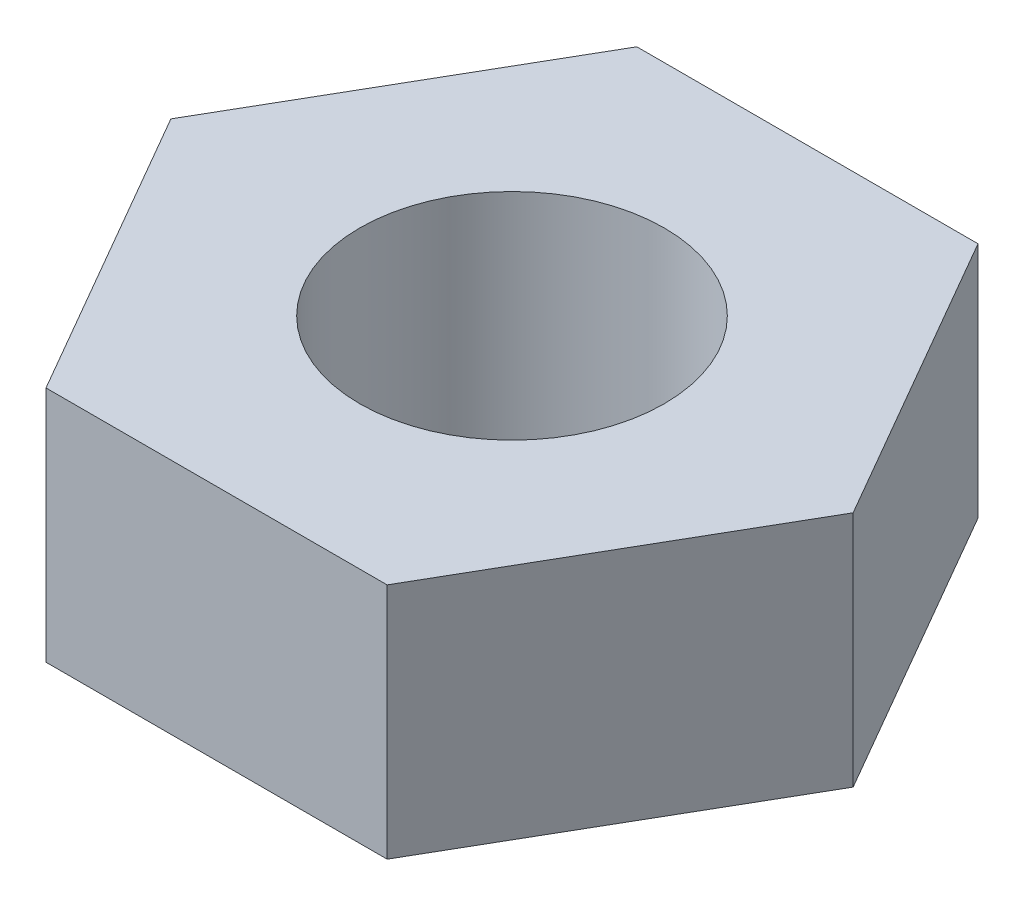
ISO-10303-21;
HEADER;
FILE_DESCRIPTION(('STEP AP214'),'2;1');
FILE_NAME('part.step','',(''),(''),'','','');
FILE_SCHEMA(('AUTOMOTIVE_DESIGN { 1 0 10303 214 1 1 1 1 }'));
ENDSEC;
DATA;
#1=APPLICATION_CONTEXT('core data for automotive mechanical design processes');
#2=APPLICATION_PROTOCOL_DEFINITION('international standard','automotive_design',2000,#1);
#3=PRODUCT_CONTEXT('',#1,'mechanical');
#4=PRODUCT('Part','Part','',(#3));
#5=PRODUCT_RELATED_PRODUCT_CATEGORY('part','',(#4));
#6=PRODUCT_DEFINITION_FORMATION('','',#4);
#7=PRODUCT_DEFINITION_CONTEXT('part definition',#1,'design');
#8=PRODUCT_DEFINITION('design','',#6,#7);
#9=PRODUCT_DEFINITION_SHAPE('','',#8);
#10=(LENGTH_UNIT() NAMED_UNIT(*) SI_UNIT(.MILLI.,.METRE.));
#11=(NAMED_UNIT(*) PLANE_ANGLE_UNIT() SI_UNIT($,.RADIAN.));
#12=(NAMED_UNIT(*) SI_UNIT($,.STERADIAN.) SOLID_ANGLE_UNIT());
#13=UNCERTAINTY_MEASURE_WITH_UNIT(LENGTH_MEASURE(1.E-05),#10,'distance_accuracy_value','');
#14=(GEOMETRIC_REPRESENTATION_CONTEXT(3) GLOBAL_UNCERTAINTY_ASSIGNED_CONTEXT((#13)) GLOBAL_UNIT_ASSIGNED_CONTEXT((#10,
#11,#12)) REPRESENTATION_CONTEXT('',''));
#15=CARTESIAN_POINT('',(0.,0.,0.));
#16=DIRECTION('',(0.,0.,1.));
#17=DIRECTION('',(1.,0.,0.));
#18=AXIS2_PLACEMENT_3D('',#15,#16,#17);
#19=CARTESIAN_POINT('',(0.,1.95,0.));
#20=DIRECTION('',(0.,1.,0.));
#21=DIRECTION('',(0.,0.,1.));
#22=AXIS2_PLACEMENT_3D('',#19,#20,#21);
#23=PLANE('',#22);
#24=DIRECTION('',(1.,0.,0.));
#25=VECTOR('',#24,1.);
#26=CARTESIAN_POINT('',(-1.40007440278484,1.95,2.425));
#27=LINE('',#26,#25);
#28=CARTESIAN_POINT('',(-1.40007440278484,1.95,2.425));
#29=VERTEX_POINT('',#28);
#30=CARTESIAN_POINT('',(1.40007440278484,1.95,2.425));
#31=VERTEX_POINT('',#30);
#32=EDGE_CURVE('E129',#29,#31,#27,.T.);
#33=ORIENTED_EDGE('',*,*,#32,.T.);
#34=DIRECTION('',(0.5,0.,-0.866025403784439));
#35=VECTOR('',#34,1.);
#36=CARTESIAN_POINT('',(1.40007440278484,1.95,2.425));
#37=LINE('',#36,#35);
#38=CARTESIAN_POINT('',(2.80014880556968,1.95,0.));
#39=VERTEX_POINT('',#38);
#40=EDGE_CURVE('E87',#31,#39,#37,.T.);
#41=ORIENTED_EDGE('',*,*,#40,.T.);
#42=DIRECTION('',(-0.5,0.,-0.866025403784438));
#43=VECTOR('',#42,1.);
#44=CARTESIAN_POINT('',(2.80014880556968,1.95,0.));
#45=LINE('',#44,#43);
#46=CARTESIAN_POINT('',(1.40007440278484,1.95,-2.425));
#47=VERTEX_POINT('',#46);
#48=EDGE_CURVE('E100',#39,#47,#45,.T.);
#49=ORIENTED_EDGE('',*,*,#48,.T.);
#50=DIRECTION('',(-1.,0.,0.));
#51=VECTOR('',#50,1.);
#52=CARTESIAN_POINT('',(1.40007440278484,1.95,-2.425));
#53=LINE('',#52,#51);
#54=CARTESIAN_POINT('',(-1.40007440278484,1.95,-2.425));
#55=VERTEX_POINT('',#54);
#56=EDGE_CURVE('E94',#47,#55,#53,.T.);
#57=ORIENTED_EDGE('',*,*,#56,.T.);
#58=DIRECTION('',(-0.5,0.,0.866025403784439));
#59=VECTOR('',#58,1.);
#60=CARTESIAN_POINT('',(-1.40007440278484,1.95,-2.425));
#61=LINE('',#60,#59);
#62=CARTESIAN_POINT('',(-2.80014880556968,1.95,0.));
#63=VERTEX_POINT('',#62);
#64=EDGE_CURVE('E98',#55,#63,#61,.T.);
#65=ORIENTED_EDGE('',*,*,#64,.T.);
#66=DIRECTION('',(0.5,0.,0.866025403784439));
#67=VECTOR('',#66,1.);
#68=CARTESIAN_POINT('',(-2.80014880556968,1.95,0.));
#69=LINE('',#68,#67);
#70=EDGE_CURVE('E50',#63,#29,#69,.T.);
#71=ORIENTED_EDGE('',*,*,#70,.T.);
#72=EDGE_LOOP('',(#33,#41,#49,#57,#65,#71));
#73=FACE_BOUND('',#72,.T.);
#74=CARTESIAN_POINT('',(0.,1.95,0.));
#75=DIRECTION('',(0.,1.,0.));
#76=DIRECTION('',(0.,0.,1.));
#77=AXIS2_PLACEMENT_3D('',#74,#75,#76);
#78=CIRCLE('',#77,1.25);
#79=CARTESIAN_POINT('',(0.,1.95,1.25));
#80=VERTEX_POINT('',#79);
#81=EDGE_CURVE('E122',#80,#80,#78,.T.);
#82=ORIENTED_EDGE('',*,*,#81,.F.);
#83=EDGE_LOOP('',(#82));
#84=FACE_BOUND('',#83,.T.);
#85=ADVANCED_FACE('F33',(#73,#84),#23,.T.);
#86=CARTESIAN_POINT('',(0.,0.,0.));
#87=DIRECTION('',(0.,1.,0.));
#88=DIRECTION('',(0.,0.,1.));
#89=AXIS2_PLACEMENT_3D('',#86,#87,#88);
#90=PLANE('',#89);
#91=DIRECTION('',(1.,0.,0.));
#92=VECTOR('',#91,1.);
#93=CARTESIAN_POINT('',(-1.40007440278484,0.,2.425));
#94=LINE('',#93,#92);
#95=CARTESIAN_POINT('',(-1.40007440278484,0.,2.425));
#96=VERTEX_POINT('',#95);
#97=CARTESIAN_POINT('',(1.40007440278484,0.,2.425));
#98=VERTEX_POINT('',#97);
#99=EDGE_CURVE('E118',#96,#98,#94,.T.);
#100=ORIENTED_EDGE('',*,*,#99,.F.);
#101=DIRECTION('',(0.5,0.,0.866025403784439));
#102=VECTOR('',#101,1.);
#103=CARTESIAN_POINT('',(-2.80014880556968,0.,0.));
#104=LINE('',#103,#102);
#105=CARTESIAN_POINT('',(-2.80014880556968,0.,0.));
#106=VERTEX_POINT('',#105);
#107=EDGE_CURVE('E79',#106,#96,#104,.T.);
#108=ORIENTED_EDGE('',*,*,#107,.F.);
#109=DIRECTION('',(-0.5,0.,0.866025403784439));
#110=VECTOR('',#109,1.);
#111=CARTESIAN_POINT('',(-1.40007440278484,0.,-2.425));
#112=LINE('',#111,#110);
#113=CARTESIAN_POINT('',(-1.40007440278484,0.,-2.425));
#114=VERTEX_POINT('',#113);
#115=EDGE_CURVE('E73',#114,#106,#112,.T.);
#116=ORIENTED_EDGE('',*,*,#115,.F.);
#117=DIRECTION('',(-1.,0.,0.));
#118=VECTOR('',#117,1.);
#119=CARTESIAN_POINT('',(1.40007440278484,0.,-2.425));
#120=LINE('',#119,#118);
#121=CARTESIAN_POINT('',(1.40007440278484,0.,-2.425));
#122=VERTEX_POINT('',#121);
#123=EDGE_CURVE('E108',#122,#114,#120,.T.);
#124=ORIENTED_EDGE('',*,*,#123,.F.);
#125=DIRECTION('',(-0.5,0.,-0.866025403784438));
#126=VECTOR('',#125,1.);
#127=CARTESIAN_POINT('',(2.80014880556968,0.,0.));
#128=LINE('',#127,#126);
#129=CARTESIAN_POINT('',(2.80014880556968,0.,0.));
#130=VERTEX_POINT('',#129);
#131=EDGE_CURVE('E124',#130,#122,#128,.T.);
#132=ORIENTED_EDGE('',*,*,#131,.F.);
#133=DIRECTION('',(0.5,0.,-0.866025403784439));
#134=VECTOR('',#133,1.);
#135=CARTESIAN_POINT('',(1.40007440278484,0.,2.425));
#136=LINE('',#135,#134);
#137=EDGE_CURVE('E121',#98,#130,#136,.T.);
#138=ORIENTED_EDGE('',*,*,#137,.F.);
#139=EDGE_LOOP('',(#100,#108,#116,#124,#132,#138));
#140=FACE_BOUND('',#139,.T.);
#141=CARTESIAN_POINT('',(0.,0.,0.));
#142=DIRECTION('',(0.,1.,0.));
#143=DIRECTION('',(0.,0.,1.));
#144=AXIS2_PLACEMENT_3D('',#141,#142,#143);
#145=CIRCLE('',#144,1.25);
#146=CARTESIAN_POINT('',(0.,0.,1.25));
#147=VERTEX_POINT('',#146);
#148=EDGE_CURVE('E222',#147,#147,#145,.T.);
#149=ORIENTED_EDGE('',*,*,#148,.T.);
#150=EDGE_LOOP('',(#149));
#151=FACE_BOUND('',#150,.T.);
#152=ADVANCED_FACE('F138',(#140,#151),#90,.F.);
#153=CARTESIAN_POINT('',(-1.40007440278484,1.95,2.425));
#154=DIRECTION('',(0.,0.,-1.));
#155=DIRECTION('',(-1.,0.,0.));
#156=AXIS2_PLACEMENT_3D('',#153,#154,#155);
#157=PLANE('',#156);
#158=ORIENTED_EDGE('',*,*,#99,.T.);
#159=DIRECTION('',(0.,-1.,0.));
#160=VECTOR('',#159,1.);
#161=CARTESIAN_POINT('',(1.40007440278484,1.95,2.425));
#162=LINE('',#161,#160);
#163=EDGE_CURVE('E11',#31,#98,#162,.T.);
#164=ORIENTED_EDGE('',*,*,#163,.F.);
#165=ORIENTED_EDGE('',*,*,#32,.F.);
#166=DIRECTION('',(0.,-1.,0.));
#167=VECTOR('',#166,1.);
#168=CARTESIAN_POINT('',(-1.40007440278484,1.95,2.425));
#169=LINE('',#168,#167);
#170=EDGE_CURVE('E114',#29,#96,#169,.T.);
#171=ORIENTED_EDGE('',*,*,#170,.T.);
#172=EDGE_LOOP('',(#158,#164,#165,#171));
#173=FACE_BOUND('',#172,.T.);
#174=ADVANCED_FACE('F35',(#173),#157,.F.);
#175=CARTESIAN_POINT('',(1.40007440278484,1.95,2.425));
#176=DIRECTION('',(-0.866025403784439,0.,-0.5));
#177=DIRECTION('',(-0.5,0.,0.866025403784439));
#178=AXIS2_PLACEMENT_3D('',#175,#176,#177);
#179=PLANE('',#178);
#180=ORIENTED_EDGE('',*,*,#137,.T.);
#181=DIRECTION('',(0.,-1.,0.));
#182=VECTOR('',#181,1.);
#183=CARTESIAN_POINT('',(2.80014880556968,1.95,0.));
#184=LINE('',#183,#182);
#185=EDGE_CURVE('E42',#39,#130,#184,.T.);
#186=ORIENTED_EDGE('',*,*,#185,.F.);
#187=ORIENTED_EDGE('',*,*,#40,.F.);
#188=ORIENTED_EDGE('',*,*,#163,.T.);
#189=EDGE_LOOP('',(#180,#186,#187,#188));
#190=FACE_BOUND('',#189,.T.);
#191=ADVANCED_FACE('F163',(#190),#179,.F.);
#192=CARTESIAN_POINT('',(2.80014880556968,1.95,0.));
#193=DIRECTION('',(-0.866025403784439,0.,0.5));
#194=DIRECTION('',(0.5,0.,0.866025403784439));
#195=AXIS2_PLACEMENT_3D('',#192,#193,#194);
#196=PLANE('',#195);
#197=ORIENTED_EDGE('',*,*,#131,.T.);
#198=DIRECTION('',(0.,-1.,0.));
#199=VECTOR('',#198,1.);
#200=CARTESIAN_POINT('',(1.40007440278484,1.95,-2.425));
#201=LINE('',#200,#199);
#202=EDGE_CURVE('E109',#47,#122,#201,.T.);
#203=ORIENTED_EDGE('',*,*,#202,.F.);
#204=ORIENTED_EDGE('',*,*,#48,.F.);
#205=ORIENTED_EDGE('',*,*,#185,.T.);
#206=EDGE_LOOP('',(#197,#203,#204,#205));
#207=FACE_BOUND('',#206,.T.);
#208=ADVANCED_FACE('F135',(#207),#196,.F.);
#209=CARTESIAN_POINT('',(1.40007440278484,1.95,-2.425));
#210=DIRECTION('',(0.,0.,1.));
#211=DIRECTION('',(1.,0.,0.));
#212=AXIS2_PLACEMENT_3D('',#209,#210,#211);
#213=PLANE('',#212);
#214=ORIENTED_EDGE('',*,*,#123,.T.);
#215=DIRECTION('',(0.,-1.,0.));
#216=VECTOR('',#215,1.);
#217=CARTESIAN_POINT('',(-1.40007440278484,1.95,-2.425));
#218=LINE('',#217,#216);
#219=EDGE_CURVE('E105',#55,#114,#218,.T.);
#220=ORIENTED_EDGE('',*,*,#219,.F.);
#221=ORIENTED_EDGE('',*,*,#56,.F.);
#222=ORIENTED_EDGE('',*,*,#202,.T.);
#223=EDGE_LOOP('',(#214,#220,#221,#222));
#224=FACE_BOUND('',#223,.T.);
#225=ADVANCED_FACE('F106',(#224),#213,.F.);
#226=CARTESIAN_POINT('',(-1.40007440278484,1.95,-2.425));
#227=DIRECTION('',(0.866025403784439,0.,0.5));
#228=DIRECTION('',(0.5,0.,-0.866025403784439));
#229=AXIS2_PLACEMENT_3D('',#226,#227,#228);
#230=PLANE('',#229);
#231=ORIENTED_EDGE('',*,*,#115,.T.);
#232=DIRECTION('',(0.,-1.,0.));
#233=VECTOR('',#232,1.);
#234=CARTESIAN_POINT('',(-2.80014880556968,1.95,0.));
#235=LINE('',#234,#233);
#236=EDGE_CURVE('E110',#63,#106,#235,.T.);
#237=ORIENTED_EDGE('',*,*,#236,.F.);
#238=ORIENTED_EDGE('',*,*,#64,.F.);
#239=ORIENTED_EDGE('',*,*,#219,.T.);
#240=EDGE_LOOP('',(#231,#237,#238,#239));
#241=FACE_BOUND('',#240,.T.);
#242=ADVANCED_FACE('F112',(#241),#230,.F.);
#243=CARTESIAN_POINT('',(-2.80014880556968,1.95,0.));
#244=DIRECTION('',(0.866025403784439,0.,-0.5));
#245=DIRECTION('',(-0.5,0.,-0.866025403784439));
#246=AXIS2_PLACEMENT_3D('',#243,#244,#245);
#247=PLANE('',#246);
#248=ORIENTED_EDGE('',*,*,#107,.T.);
#249=ORIENTED_EDGE('',*,*,#170,.F.);
#250=ORIENTED_EDGE('',*,*,#70,.F.);
#251=ORIENTED_EDGE('',*,*,#236,.T.);
#252=EDGE_LOOP('',(#248,#249,#250,#251));
#253=FACE_BOUND('',#252,.T.);
#254=ADVANCED_FACE('F143',(#253),#247,.F.);
#255=CARTESIAN_POINT('',(0.,1.95,0.));
#256=DIRECTION('',(0.,-1.,0.));
#257=DIRECTION('',(0.,0.,-1.));
#258=AXIS2_PLACEMENT_3D('',#255,#256,#257);
#259=CYLINDRICAL_SURFACE('',#258,1.25);
#260=ORIENTED_EDGE('',*,*,#81,.T.);
#261=EDGE_LOOP('',(#260));
#262=FACE_BOUND('',#261,.T.);
#263=ORIENTED_EDGE('',*,*,#148,.F.);
#264=EDGE_LOOP('',(#263));
#265=FACE_BOUND('',#264,.T.);
#266=ADVANCED_FACE('F145',(#262,#265),#259,.F.);
#267=CLOSED_SHELL('',(#85,#152,#174,#191,#208,#225,#242,#254,#266));
#268=MANIFOLD_SOLID_BREP('B2',#267);
#269=ADVANCED_BREP_SHAPE_REPRESENTATION('',(#18,#268),#14);
#270=SHAPE_DEFINITION_REPRESENTATION(#9,#269);
ENDSEC;
END-ISO-10303-21;
